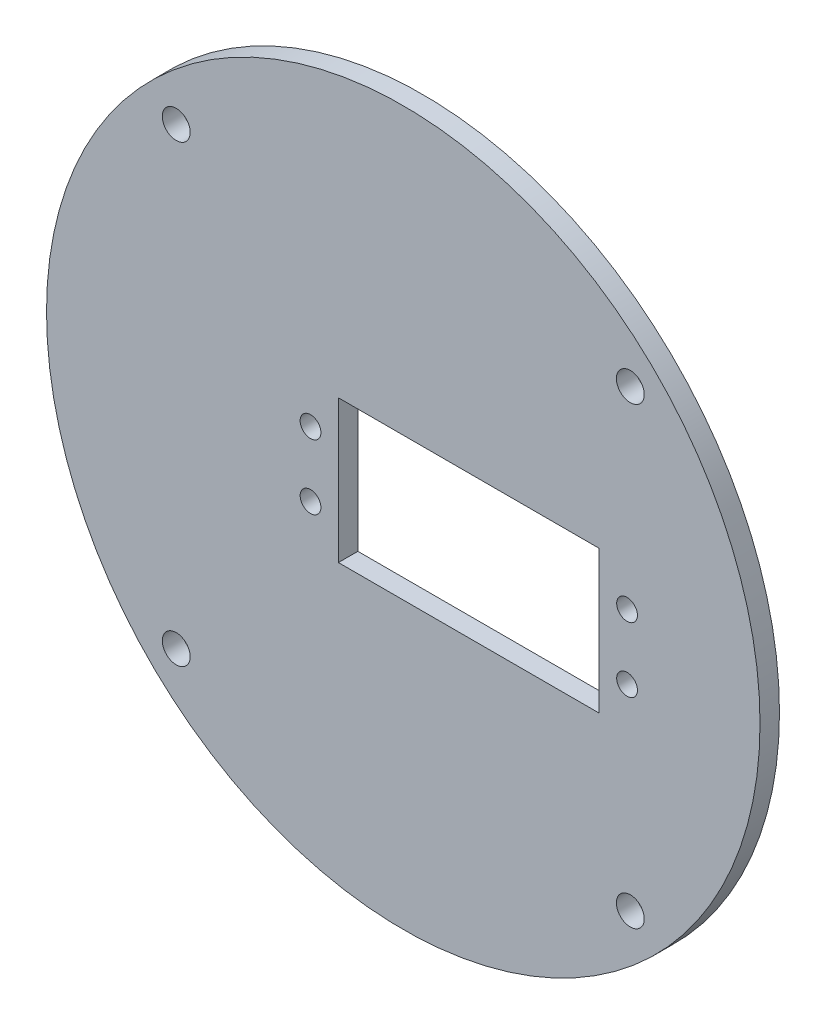
ISO-10303-21;
HEADER;
FILE_DESCRIPTION(('STEP AP214'),'2;1');
FILE_NAME('part.step','',(''),(''),'','','');
FILE_SCHEMA(('AUTOMOTIVE_DESIGN { 1 0 10303 214 1 1 1 1 }'));
ENDSEC;
DATA;
#1=APPLICATION_CONTEXT('core data for automotive mechanical design processes');
#2=APPLICATION_PROTOCOL_DEFINITION('international standard','automotive_design',2000,#1);
#3=PRODUCT_CONTEXT('',#1,'mechanical');
#4=PRODUCT('Part','Part','',(#3));
#5=PRODUCT_RELATED_PRODUCT_CATEGORY('part','',(#4));
#6=PRODUCT_DEFINITION_FORMATION('','',#4);
#7=PRODUCT_DEFINITION_CONTEXT('part definition',#1,'design');
#8=PRODUCT_DEFINITION('design','',#6,#7);
#9=PRODUCT_DEFINITION_SHAPE('','',#8);
#10=(LENGTH_UNIT() NAMED_UNIT(*) SI_UNIT(.MILLI.,.METRE.));
#11=(NAMED_UNIT(*) PLANE_ANGLE_UNIT() SI_UNIT($,.RADIAN.));
#12=(NAMED_UNIT(*) SI_UNIT($,.STERADIAN.) SOLID_ANGLE_UNIT());
#13=UNCERTAINTY_MEASURE_WITH_UNIT(LENGTH_MEASURE(1.E-05),#10,'distance_accuracy_value','');
#14=(GEOMETRIC_REPRESENTATION_CONTEXT(3) GLOBAL_UNCERTAINTY_ASSIGNED_CONTEXT((#13)) GLOBAL_UNIT_ASSIGNED_CONTEXT((#10,
#11,#12)) REPRESENTATION_CONTEXT('',''));
#15=CARTESIAN_POINT('',(0.,0.,0.));
#16=DIRECTION('',(0.,0.,1.));
#17=DIRECTION('',(1.,0.,0.));
#18=AXIS2_PLACEMENT_3D('',#15,#16,#17);
#19=CARTESIAN_POINT('',(0.,-11.,3.));
#20=DIRECTION('',(0.,1.,0.));
#21=DIRECTION('',(-1.,0.,0.));
#22=AXIS2_PLACEMENT_3D('',#19,#20,#21);
#23=PLANE('',#22);
#24=DIRECTION('',(1.,0.,0.));
#25=VECTOR('',#24,1.);
#26=CARTESIAN_POINT('',(0.,-11.,0.));
#27=LINE('',#26,#25);
#28=CARTESIAN_POINT('',(-10.,-11.,0.));
#29=VERTEX_POINT('',#28);
#30=CARTESIAN_POINT('',(30.2,-11.,0.));
#31=VERTEX_POINT('',#30);
#32=EDGE_CURVE('E156',#29,#31,#27,.T.);
#33=ORIENTED_EDGE('',*,*,#32,.F.);
#34=DIRECTION('',(0.,0.,-1.));
#35=VECTOR('',#34,1.);
#36=CARTESIAN_POINT('',(-10.,-11.,3.));
#37=LINE('',#36,#35);
#38=CARTESIAN_POINT('',(-10.,-11.,3.));
#39=VERTEX_POINT('',#38);
#40=EDGE_CURVE('E11',#39,#29,#37,.T.);
#41=ORIENTED_EDGE('',*,*,#40,.F.);
#42=DIRECTION('',(1.,0.,0.));
#43=VECTOR('',#42,1.);
#44=CARTESIAN_POINT('',(0.,-11.,3.));
#45=LINE('',#44,#43);
#46=CARTESIAN_POINT('',(30.2,-11.,3.));
#47=VERTEX_POINT('',#46);
#48=EDGE_CURVE('E115',#39,#47,#45,.T.);
#49=ORIENTED_EDGE('',*,*,#48,.T.);
#50=DIRECTION('',(0.,0.,-1.));
#51=VECTOR('',#50,1.);
#52=CARTESIAN_POINT('',(30.2,-11.,3.));
#53=LINE('',#52,#51);
#54=EDGE_CURVE('E88',#47,#31,#53,.T.);
#55=ORIENTED_EDGE('',*,*,#54,.T.);
#56=EDGE_LOOP('',(#33,#41,#49,#55));
#57=FACE_BOUND('',#56,.T.);
#58=ADVANCED_FACE('F50',(#57),#23,.T.);
#59=CARTESIAN_POINT('',(-10.,0.,3.));
#60=DIRECTION('',(1.,0.,0.));
#61=DIRECTION('',(0.,0.,-1.));
#62=AXIS2_PLACEMENT_3D('',#59,#60,#61);
#63=PLANE('',#62);
#64=DIRECTION('',(0.,-1.,0.));
#65=VECTOR('',#64,1.);
#66=CARTESIAN_POINT('',(-10.,0.,0.));
#67=LINE('',#66,#65);
#68=CARTESIAN_POINT('',(-10.,11.,0.));
#69=VERTEX_POINT('',#68);
#70=EDGE_CURVE('E99',#69,#29,#67,.T.);
#71=ORIENTED_EDGE('',*,*,#70,.F.);
#72=DIRECTION('',(0.,0.,-1.));
#73=VECTOR('',#72,1.);
#74=CARTESIAN_POINT('',(-10.,11.,3.));
#75=LINE('',#74,#73);
#76=CARTESIAN_POINT('',(-10.,11.,3.));
#77=VERTEX_POINT('',#76);
#78=EDGE_CURVE('E60',#77,#69,#75,.T.);
#79=ORIENTED_EDGE('',*,*,#78,.F.);
#80=DIRECTION('',(0.,-1.,0.));
#81=VECTOR('',#80,1.);
#82=CARTESIAN_POINT('',(-10.,0.,3.));
#83=LINE('',#82,#81);
#84=EDGE_CURVE('E96',#77,#39,#83,.T.);
#85=ORIENTED_EDGE('',*,*,#84,.T.);
#86=ORIENTED_EDGE('',*,*,#40,.T.);
#87=EDGE_LOOP('',(#71,#79,#85,#86));
#88=FACE_BOUND('',#87,.T.);
#89=ADVANCED_FACE('F98',(#88),#63,.T.);
#90=CARTESIAN_POINT('',(0.,11.,3.));
#91=DIRECTION('',(0.,1.,0.));
#92=DIRECTION('',(-1.,0.,0.));
#93=AXIS2_PLACEMENT_3D('',#90,#91,#92);
#94=PLANE('',#93);
#95=DIRECTION('',(1.,0.,0.));
#96=VECTOR('',#95,1.);
#97=CARTESIAN_POINT('',(0.,11.,0.));
#98=LINE('',#97,#96);
#99=CARTESIAN_POINT('',(30.2,11.,0.));
#100=VERTEX_POINT('',#99);
#101=EDGE_CURVE('E161',#69,#100,#98,.T.);
#102=ORIENTED_EDGE('',*,*,#101,.T.);
#103=DIRECTION('',(0.,0.,-1.));
#104=VECTOR('',#103,1.);
#105=CARTESIAN_POINT('',(30.2,11.,3.));
#106=LINE('',#105,#104);
#107=CARTESIAN_POINT('',(30.2,11.,3.));
#108=VERTEX_POINT('',#107);
#109=EDGE_CURVE('E104',#108,#100,#106,.T.);
#110=ORIENTED_EDGE('',*,*,#109,.F.);
#111=DIRECTION('',(1.,0.,0.));
#112=VECTOR('',#111,1.);
#113=CARTESIAN_POINT('',(0.,11.,3.));
#114=LINE('',#113,#112);
#115=EDGE_CURVE('E106',#77,#108,#114,.T.);
#116=ORIENTED_EDGE('',*,*,#115,.F.);
#117=ORIENTED_EDGE('',*,*,#78,.T.);
#118=EDGE_LOOP('',(#102,#110,#116,#117));
#119=FACE_BOUND('',#118,.T.);
#120=ADVANCED_FACE('F110',(#119),#94,.F.);
#121=CARTESIAN_POINT('',(35.0017856687341,-35.0017856687341,3.));
#122=DIRECTION('',(0.,0.,-1.));
#123=DIRECTION('',(-1.,0.,0.));
#124=AXIS2_PLACEMENT_3D('',#121,#122,#123);
#125=CYLINDRICAL_SURFACE('',#124,2.15);
#126=CARTESIAN_POINT('',(35.0017856687341,-35.0017856687341,3.));
#127=DIRECTION('',(0.,0.,1.));
#128=DIRECTION('',(1.,0.,0.));
#129=AXIS2_PLACEMENT_3D('',#126,#127,#128);
#130=CIRCLE('',#129,2.15);
#131=CARTESIAN_POINT('',(37.1517856687341,-35.0017856687341,3.));
#132=VERTEX_POINT('',#131);
#133=EDGE_CURVE('E145',#132,#132,#130,.T.);
#134=ORIENTED_EDGE('',*,*,#133,.T.);
#135=EDGE_LOOP('',(#134));
#136=FACE_BOUND('',#135,.T.);
#137=CARTESIAN_POINT('',(35.0017856687341,-35.0017856687341,0.));
#138=DIRECTION('',(0.,0.,1.));
#139=DIRECTION('',(1.,0.,0.));
#140=AXIS2_PLACEMENT_3D('',#137,#138,#139);
#141=CIRCLE('',#140,2.15);
#142=CARTESIAN_POINT('',(37.1517856687341,-35.0017856687341,0.));
#143=VERTEX_POINT('',#142);
#144=EDGE_CURVE('E189',#143,#143,#141,.T.);
#145=ORIENTED_EDGE('',*,*,#144,.F.);
#146=EDGE_LOOP('',(#145));
#147=FACE_BOUND('',#146,.T.);
#148=ADVANCED_FACE('F237',(#136,#147),#125,.F.);
#149=CARTESIAN_POINT('',(-35.0017856687341,-35.0017856687341,3.));
#150=DIRECTION('',(0.,0.,-1.));
#151=DIRECTION('',(-1.,0.,0.));
#152=AXIS2_PLACEMENT_3D('',#149,#150,#151);
#153=CYLINDRICAL_SURFACE('',#152,2.15);
#154=CARTESIAN_POINT('',(-35.0017856687341,-35.0017856687341,3.));
#155=DIRECTION('',(0.,0.,1.));
#156=DIRECTION('',(1.,0.,0.));
#157=AXIS2_PLACEMENT_3D('',#154,#155,#156);
#158=CIRCLE('',#157,2.15);
#159=CARTESIAN_POINT('',(-32.8517856687341,-35.0017856687341,3.));
#160=VERTEX_POINT('',#159);
#161=EDGE_CURVE('E136',#160,#160,#158,.T.);
#162=ORIENTED_EDGE('',*,*,#161,.T.);
#163=EDGE_LOOP('',(#162));
#164=FACE_BOUND('',#163,.T.);
#165=CARTESIAN_POINT('',(-35.0017856687341,-35.0017856687341,0.));
#166=DIRECTION('',(0.,0.,1.));
#167=DIRECTION('',(1.,0.,0.));
#168=AXIS2_PLACEMENT_3D('',#165,#166,#167);
#169=CIRCLE('',#168,2.15);
#170=CARTESIAN_POINT('',(-32.8517856687341,-35.0017856687341,0.));
#171=VERTEX_POINT('',#170);
#172=EDGE_CURVE('E183',#171,#171,#169,.T.);
#173=ORIENTED_EDGE('',*,*,#172,.F.);
#174=EDGE_LOOP('',(#173));
#175=FACE_BOUND('',#174,.T.);
#176=ADVANCED_FACE('F245',(#164,#175),#153,.F.);
#177=CARTESIAN_POINT('',(35.0017856687341,35.0017856687341,3.));
#178=DIRECTION('',(0.,0.,-1.));
#179=DIRECTION('',(-1.,0.,0.));
#180=AXIS2_PLACEMENT_3D('',#177,#178,#179);
#181=CYLINDRICAL_SURFACE('',#180,2.15);
#182=CARTESIAN_POINT('',(35.0017856687341,35.0017856687341,3.));
#183=DIRECTION('',(0.,0.,1.));
#184=DIRECTION('',(1.,0.,0.));
#185=AXIS2_PLACEMENT_3D('',#182,#183,#184);
#186=CIRCLE('',#185,2.15);
#187=CARTESIAN_POINT('',(37.1517856687341,35.0017856687341,3.));
#188=VERTEX_POINT('',#187);
#189=EDGE_CURVE('E132',#188,#188,#186,.T.);
#190=ORIENTED_EDGE('',*,*,#189,.T.);
#191=EDGE_LOOP('',(#190));
#192=FACE_BOUND('',#191,.T.);
#193=CARTESIAN_POINT('',(35.0017856687341,35.0017856687341,0.));
#194=DIRECTION('',(0.,0.,1.));
#195=DIRECTION('',(1.,0.,0.));
#196=AXIS2_PLACEMENT_3D('',#193,#194,#195);
#197=CIRCLE('',#196,2.15);
#198=CARTESIAN_POINT('',(37.1517856687341,35.0017856687341,0.));
#199=VERTEX_POINT('',#198);
#200=EDGE_CURVE('E179',#199,#199,#197,.T.);
#201=ORIENTED_EDGE('',*,*,#200,.F.);
#202=EDGE_LOOP('',(#201));
#203=FACE_BOUND('',#202,.T.);
#204=ADVANCED_FACE('F246',(#192,#203),#181,.F.);
#205=CARTESIAN_POINT('',(-35.0017856687341,35.0017856687341,3.));
#206=DIRECTION('',(0.,0.,-1.));
#207=DIRECTION('',(-1.,0.,0.));
#208=AXIS2_PLACEMENT_3D('',#205,#206,#207);
#209=CYLINDRICAL_SURFACE('',#208,2.15);
#210=CARTESIAN_POINT('',(-35.0017856687341,35.0017856687341,3.));
#211=DIRECTION('',(0.,0.,1.));
#212=DIRECTION('',(1.,0.,0.));
#213=AXIS2_PLACEMENT_3D('',#210,#211,#212);
#214=CIRCLE('',#213,2.15);
#215=CARTESIAN_POINT('',(-32.8517856687341,35.0017856687341,3.));
#216=VERTEX_POINT('',#215);
#217=EDGE_CURVE('E126',#216,#216,#214,.T.);
#218=ORIENTED_EDGE('',*,*,#217,.T.);
#219=EDGE_LOOP('',(#218));
#220=FACE_BOUND('',#219,.T.);
#221=CARTESIAN_POINT('',(-35.0017856687341,35.0017856687341,0.));
#222=DIRECTION('',(0.,0.,1.));
#223=DIRECTION('',(1.,0.,0.));
#224=AXIS2_PLACEMENT_3D('',#221,#222,#223);
#225=CIRCLE('',#224,2.15);
#226=CARTESIAN_POINT('',(-32.8517856687341,35.0017856687341,0.));
#227=VERTEX_POINT('',#226);
#228=EDGE_CURVE('E176',#227,#227,#225,.T.);
#229=ORIENTED_EDGE('',*,*,#228,.F.);
#230=EDGE_LOOP('',(#229));
#231=FACE_BOUND('',#230,.T.);
#232=ADVANCED_FACE('F249',(#220,#231),#209,.F.);
#233=CARTESIAN_POINT('',(-14.3,5.,3.));
#234=DIRECTION('',(0.,0.,-1.));
#235=DIRECTION('',(-1.,0.,0.));
#236=AXIS2_PLACEMENT_3D('',#233,#234,#235);
#237=CYLINDRICAL_SURFACE('',#236,1.6);
#238=CARTESIAN_POINT('',(-14.3,5.,3.));
#239=DIRECTION('',(0.,0.,1.));
#240=DIRECTION('',(1.,0.,0.));
#241=AXIS2_PLACEMENT_3D('',#238,#239,#240);
#242=CIRCLE('',#241,1.6);
#243=CARTESIAN_POINT('',(-12.7,5.,3.));
#244=VERTEX_POINT('',#243);
#245=EDGE_CURVE('E128',#244,#244,#242,.T.);
#246=ORIENTED_EDGE('',*,*,#245,.T.);
#247=EDGE_LOOP('',(#246));
#248=FACE_BOUND('',#247,.T.);
#249=CARTESIAN_POINT('',(-14.3,5.,0.));
#250=DIRECTION('',(0.,0.,1.));
#251=DIRECTION('',(1.,0.,0.));
#252=AXIS2_PLACEMENT_3D('',#249,#250,#251);
#253=CIRCLE('',#252,1.6);
#254=CARTESIAN_POINT('',(-12.7,5.,0.));
#255=VERTEX_POINT('',#254);
#256=EDGE_CURVE('E175',#255,#255,#253,.T.);
#257=ORIENTED_EDGE('',*,*,#256,.F.);
#258=EDGE_LOOP('',(#257));
#259=FACE_BOUND('',#258,.T.);
#260=ADVANCED_FACE('F251',(#248,#259),#237,.F.);
#261=CARTESIAN_POINT('',(-14.3,-5.,3.));
#262=DIRECTION('',(0.,0.,-1.));
#263=DIRECTION('',(-1.,0.,0.));
#264=AXIS2_PLACEMENT_3D('',#261,#262,#263);
#265=CYLINDRICAL_SURFACE('',#264,1.6);
#266=CARTESIAN_POINT('',(-14.3,-5.,3.));
#267=DIRECTION('',(0.,0.,1.));
#268=DIRECTION('',(1.,0.,0.));
#269=AXIS2_PLACEMENT_3D('',#266,#267,#268);
#270=CIRCLE('',#269,1.6);
#271=CARTESIAN_POINT('',(-12.7,-5.,3.));
#272=VERTEX_POINT('',#271);
#273=EDGE_CURVE('E125',#272,#272,#270,.T.);
#274=ORIENTED_EDGE('',*,*,#273,.T.);
#275=EDGE_LOOP('',(#274));
#276=FACE_BOUND('',#275,.T.);
#277=CARTESIAN_POINT('',(-14.3,-5.,0.));
#278=DIRECTION('',(0.,0.,1.));
#279=DIRECTION('',(1.,0.,0.));
#280=AXIS2_PLACEMENT_3D('',#277,#278,#279);
#281=CIRCLE('',#280,1.6);
#282=CARTESIAN_POINT('',(-12.7,-5.,0.));
#283=VERTEX_POINT('',#282);
#284=EDGE_CURVE('E166',#283,#283,#281,.T.);
#285=ORIENTED_EDGE('',*,*,#284,.F.);
#286=EDGE_LOOP('',(#285));
#287=FACE_BOUND('',#286,.T.);
#288=ADVANCED_FACE('F219',(#276,#287),#265,.F.);
#289=CARTESIAN_POINT('',(30.2,0.,3.));
#290=DIRECTION('',(1.,0.,0.));
#291=DIRECTION('',(0.,0.,-1.));
#292=AXIS2_PLACEMENT_3D('',#289,#290,#291);
#293=PLANE('',#292);
#294=DIRECTION('',(0.,-1.,0.));
#295=VECTOR('',#294,1.);
#296=CARTESIAN_POINT('',(30.2,0.,0.));
#297=LINE('',#296,#295);
#298=EDGE_CURVE('E83',#100,#31,#297,.T.);
#299=ORIENTED_EDGE('',*,*,#298,.T.);
#300=ORIENTED_EDGE('',*,*,#54,.F.);
#301=DIRECTION('',(0.,-1.,0.));
#302=VECTOR('',#301,1.);
#303=CARTESIAN_POINT('',(30.2,0.,3.));
#304=LINE('',#303,#302);
#305=EDGE_CURVE('E61',#108,#47,#304,.T.);
#306=ORIENTED_EDGE('',*,*,#305,.F.);
#307=ORIENTED_EDGE('',*,*,#109,.T.);
#308=EDGE_LOOP('',(#299,#300,#306,#307));
#309=FACE_BOUND('',#308,.T.);
#310=ADVANCED_FACE('F203',(#309),#293,.F.);
#311=CARTESIAN_POINT('',(34.5,5.,3.));
#312=DIRECTION('',(0.,0.,-1.));
#313=DIRECTION('',(-1.,0.,0.));
#314=AXIS2_PLACEMENT_3D('',#311,#312,#313);
#315=CYLINDRICAL_SURFACE('',#314,1.6);
#316=CARTESIAN_POINT('',(34.5,5.,3.));
#317=DIRECTION('',(0.,0.,1.));
#318=DIRECTION('',(1.,0.,0.));
#319=AXIS2_PLACEMENT_3D('',#316,#317,#318);
#320=CIRCLE('',#319,1.6);
#321=CARTESIAN_POINT('',(36.1,5.,3.));
#322=VERTEX_POINT('',#321);
#323=EDGE_CURVE('E116',#322,#322,#320,.T.);
#324=ORIENTED_EDGE('',*,*,#323,.T.);
#325=EDGE_LOOP('',(#324));
#326=FACE_BOUND('',#325,.T.);
#327=CARTESIAN_POINT('',(34.5,5.,0.));
#328=DIRECTION('',(0.,0.,1.));
#329=DIRECTION('',(1.,0.,0.));
#330=AXIS2_PLACEMENT_3D('',#327,#328,#329);
#331=CIRCLE('',#330,1.6);
#332=CARTESIAN_POINT('',(36.1,5.,0.));
#333=VERTEX_POINT('',#332);
#334=EDGE_CURVE('E152',#333,#333,#331,.T.);
#335=ORIENTED_EDGE('',*,*,#334,.F.);
#336=EDGE_LOOP('',(#335));
#337=FACE_BOUND('',#336,.T.);
#338=ADVANCED_FACE('F213',(#326,#337),#315,.F.);
#339=CARTESIAN_POINT('',(34.5,-5.,3.));
#340=DIRECTION('',(0.,0.,-1.));
#341=DIRECTION('',(-1.,0.,0.));
#342=AXIS2_PLACEMENT_3D('',#339,#340,#341);
#343=CYLINDRICAL_SURFACE('',#342,1.6);
#344=CARTESIAN_POINT('',(34.5,-5.,3.));
#345=DIRECTION('',(0.,0.,1.));
#346=DIRECTION('',(1.,0.,0.));
#347=AXIS2_PLACEMENT_3D('',#344,#345,#346);
#348=CIRCLE('',#347,1.6);
#349=CARTESIAN_POINT('',(36.1,-5.,3.));
#350=VERTEX_POINT('',#349);
#351=EDGE_CURVE('E196',#350,#350,#348,.T.);
#352=ORIENTED_EDGE('',*,*,#351,.T.);
#353=EDGE_LOOP('',(#352));
#354=FACE_BOUND('',#353,.T.);
#355=CARTESIAN_POINT('',(34.5,-5.,0.));
#356=DIRECTION('',(0.,0.,1.));
#357=DIRECTION('',(1.,0.,0.));
#358=AXIS2_PLACEMENT_3D('',#355,#356,#357);
#359=CIRCLE('',#358,1.6);
#360=CARTESIAN_POINT('',(36.1,-5.,0.));
#361=VERTEX_POINT('',#360);
#362=EDGE_CURVE('E146',#361,#361,#359,.T.);
#363=ORIENTED_EDGE('',*,*,#362,.F.);
#364=EDGE_LOOP('',(#363));
#365=FACE_BOUND('',#364,.T.);
#366=ADVANCED_FACE('F47',(#354,#365),#343,.F.);
#367=CARTESIAN_POINT('',(0.,0.,3.));
#368=DIRECTION('',(0.,0.,-1.));
#369=DIRECTION('',(-1.,0.,0.));
#370=AXIS2_PLACEMENT_3D('',#367,#368,#369);
#371=CYLINDRICAL_SURFACE('',#370,55.);
#372=CARTESIAN_POINT('',(0.,0.,3.));
#373=DIRECTION('',(0.,0.,1.));
#374=DIRECTION('',(1.,0.,0.));
#375=AXIS2_PLACEMENT_3D('',#372,#373,#374);
#376=CIRCLE('',#375,55.);
#377=CARTESIAN_POINT('',(55.,0.,3.));
#378=VERTEX_POINT('',#377);
#379=EDGE_CURVE('E148',#378,#378,#376,.T.);
#380=ORIENTED_EDGE('',*,*,#379,.F.);
#381=EDGE_LOOP('',(#380));
#382=FACE_BOUND('',#381,.T.);
#383=CARTESIAN_POINT('',(0.,0.,0.));
#384=DIRECTION('',(0.,0.,1.));
#385=DIRECTION('',(1.,0.,0.));
#386=AXIS2_PLACEMENT_3D('',#383,#384,#385);
#387=CIRCLE('',#386,55.);
#388=CARTESIAN_POINT('',(55.,0.,0.));
#389=VERTEX_POINT('',#388);
#390=EDGE_CURVE('E194',#389,#389,#387,.T.);
#391=ORIENTED_EDGE('',*,*,#390,.T.);
#392=EDGE_LOOP('',(#391));
#393=FACE_BOUND('',#392,.T.);
#394=ADVANCED_FACE('F218',(#382,#393),#371,.T.);
#395=CARTESIAN_POINT('',(0.,0.,3.));
#396=DIRECTION('',(0.,0.,1.));
#397=DIRECTION('',(1.,0.,0.));
#398=AXIS2_PLACEMENT_3D('',#395,#396,#397);
#399=PLANE('',#398);
#400=ORIENTED_EDGE('',*,*,#351,.F.);
#401=EDGE_LOOP('',(#400));
#402=FACE_BOUND('',#401,.T.);
#403=ORIENTED_EDGE('',*,*,#323,.F.);
#404=EDGE_LOOP('',(#403));
#405=FACE_BOUND('',#404,.T.);
#406=ORIENTED_EDGE('',*,*,#48,.F.);
#407=ORIENTED_EDGE('',*,*,#84,.F.);
#408=ORIENTED_EDGE('',*,*,#115,.T.);
#409=ORIENTED_EDGE('',*,*,#305,.T.);
#410=EDGE_LOOP('',(#406,#407,#408,#409));
#411=FACE_BOUND('',#410,.T.);
#412=ORIENTED_EDGE('',*,*,#273,.F.);
#413=EDGE_LOOP('',(#412));
#414=FACE_BOUND('',#413,.T.);
#415=ORIENTED_EDGE('',*,*,#245,.F.);
#416=EDGE_LOOP('',(#415));
#417=FACE_BOUND('',#416,.T.);
#418=ORIENTED_EDGE('',*,*,#217,.F.);
#419=EDGE_LOOP('',(#418));
#420=FACE_BOUND('',#419,.T.);
#421=ORIENTED_EDGE('',*,*,#189,.F.);
#422=EDGE_LOOP('',(#421));
#423=FACE_BOUND('',#422,.T.);
#424=ORIENTED_EDGE('',*,*,#161,.F.);
#425=EDGE_LOOP('',(#424));
#426=FACE_BOUND('',#425,.T.);
#427=ORIENTED_EDGE('',*,*,#133,.F.);
#428=EDGE_LOOP('',(#427));
#429=FACE_BOUND('',#428,.T.);
#430=ORIENTED_EDGE('',*,*,#379,.T.);
#431=EDGE_LOOP('',(#430));
#432=FACE_BOUND('',#431,.T.);
#433=ADVANCED_FACE('F109',(#402,#405,#411,#414,#417,#420,#423,#426,#429,#432),#399,.T.);
#434=CARTESIAN_POINT('',(0.,0.,0.));
#435=DIRECTION('',(0.,0.,1.));
#436=DIRECTION('',(1.,0.,0.));
#437=AXIS2_PLACEMENT_3D('',#434,#435,#436);
#438=PLANE('',#437);
#439=ORIENTED_EDGE('',*,*,#362,.T.);
#440=EDGE_LOOP('',(#439));
#441=FACE_BOUND('',#440,.T.);
#442=ORIENTED_EDGE('',*,*,#334,.T.);
#443=EDGE_LOOP('',(#442));
#444=FACE_BOUND('',#443,.T.);
#445=ORIENTED_EDGE('',*,*,#32,.T.);
#446=ORIENTED_EDGE('',*,*,#298,.F.);
#447=ORIENTED_EDGE('',*,*,#101,.F.);
#448=ORIENTED_EDGE('',*,*,#70,.T.);
#449=EDGE_LOOP('',(#445,#446,#447,#448));
#450=FACE_BOUND('',#449,.T.);
#451=ORIENTED_EDGE('',*,*,#284,.T.);
#452=EDGE_LOOP('',(#451));
#453=FACE_BOUND('',#452,.T.);
#454=ORIENTED_EDGE('',*,*,#256,.T.);
#455=EDGE_LOOP('',(#454));
#456=FACE_BOUND('',#455,.T.);
#457=ORIENTED_EDGE('',*,*,#228,.T.);
#458=EDGE_LOOP('',(#457));
#459=FACE_BOUND('',#458,.T.);
#460=ORIENTED_EDGE('',*,*,#200,.T.);
#461=EDGE_LOOP('',(#460));
#462=FACE_BOUND('',#461,.T.);
#463=ORIENTED_EDGE('',*,*,#172,.T.);
#464=EDGE_LOOP('',(#463));
#465=FACE_BOUND('',#464,.T.);
#466=ORIENTED_EDGE('',*,*,#144,.T.);
#467=EDGE_LOOP('',(#466));
#468=FACE_BOUND('',#467,.T.);
#469=ORIENTED_EDGE('',*,*,#390,.F.);
#470=EDGE_LOOP('',(#469));
#471=FACE_BOUND('',#470,.T.);
#472=ADVANCED_FACE('F205',(#441,#444,#450,#453,#456,#459,#462,#465,#468,#471),#438,.F.);
#473=CLOSED_SHELL('',(#58,#89,#120,#148,#176,#204,#232,#260,#288,#310,#338,#366,#394,#433,#472));
#474=MANIFOLD_SOLID_BREP('B2',#473);
#475=ADVANCED_BREP_SHAPE_REPRESENTATION('',(#18,#474),#14);
#476=SHAPE_DEFINITION_REPRESENTATION(#9,#475);
ENDSEC;
END-ISO-10303-21;
